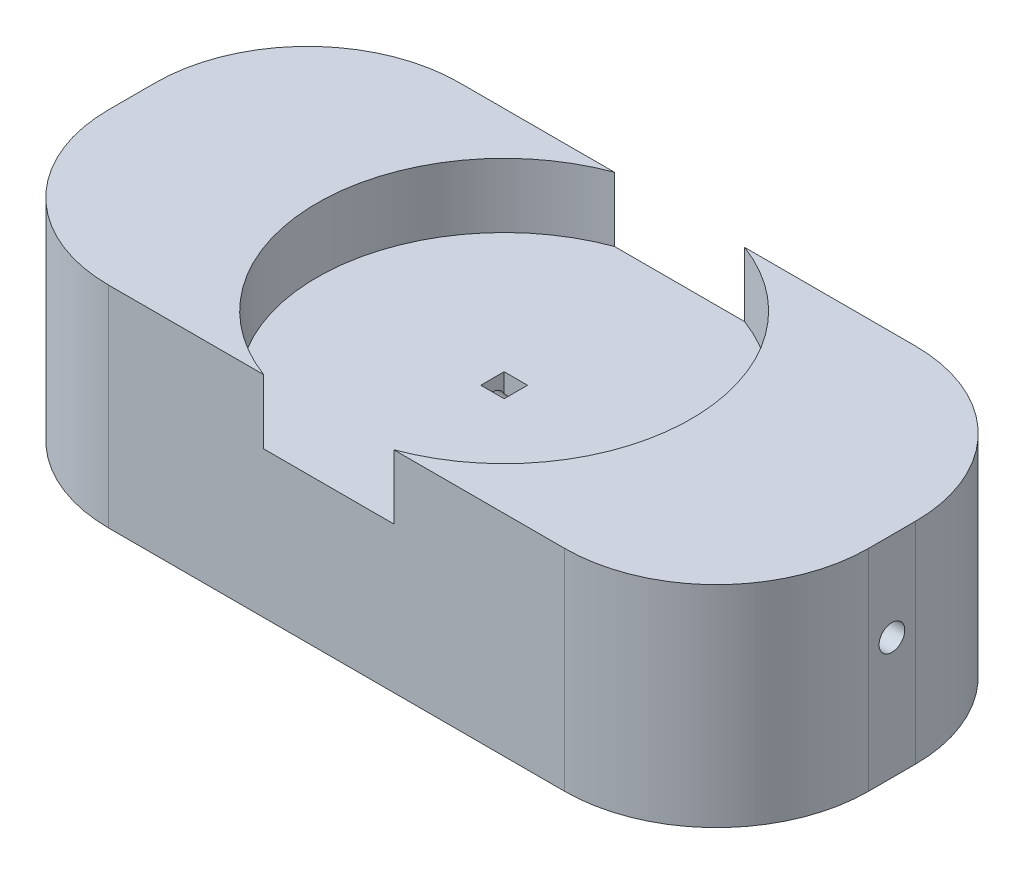
ISO-10303-21;
HEADER;
FILE_DESCRIPTION(('STEP AP214'),'2;1');
FILE_NAME('part.step','',(''),(''),'','','');
FILE_SCHEMA(('AUTOMOTIVE_DESIGN { 1 0 10303 214 1 1 1 1 }'));
ENDSEC;
DATA;
#1=APPLICATION_CONTEXT('core data for automotive mechanical design processes');
#2=APPLICATION_PROTOCOL_DEFINITION('international standard','automotive_design',2000,#1);
#3=PRODUCT_CONTEXT('',#1,'mechanical');
#4=PRODUCT('Part','Part','',(#3));
#5=PRODUCT_RELATED_PRODUCT_CATEGORY('part','',(#4));
#6=PRODUCT_DEFINITION_FORMATION('','',#4);
#7=PRODUCT_DEFINITION_CONTEXT('part definition',#1,'design');
#8=PRODUCT_DEFINITION('design','',#6,#7);
#9=PRODUCT_DEFINITION_SHAPE('','',#8);
#10=(LENGTH_UNIT() NAMED_UNIT(*) SI_UNIT(.MILLI.,.METRE.));
#11=(NAMED_UNIT(*) PLANE_ANGLE_UNIT() SI_UNIT($,.RADIAN.));
#12=(NAMED_UNIT(*) SI_UNIT($,.STERADIAN.) SOLID_ANGLE_UNIT());
#13=UNCERTAINTY_MEASURE_WITH_UNIT(LENGTH_MEASURE(1.E-05),#10,'distance_accuracy_value','');
#14=(GEOMETRIC_REPRESENTATION_CONTEXT(3) GLOBAL_UNCERTAINTY_ASSIGNED_CONTEXT((#13)) GLOBAL_UNIT_ASSIGNED_CONTEXT((#10,
#11,#12)) REPRESENTATION_CONTEXT('',''));
#15=CARTESIAN_POINT('',(0.,0.,0.));
#16=DIRECTION('',(0.,0.,1.));
#17=DIRECTION('',(1.,0.,0.));
#18=AXIS2_PLACEMENT_3D('',#15,#16,#17);
#19=CARTESIAN_POINT('',(0.,58.,0.));
#20=DIRECTION('',(0.,-1.,0.));
#21=DIRECTION('',(0.,0.,-1.));
#22=AXIS2_PLACEMENT_3D('',#19,#20,#21);
#23=PLANE('',#22);
#24=DIRECTION('',(-1.,0.,0.));
#25=VECTOR('',#24,1.);
#26=CARTESIAN_POINT('',(-25.,58.,-15.));
#27=LINE('',#26,#25);
#28=CARTESIAN_POINT('',(27.,58.,-15.));
#29=VERTEX_POINT('',#28);
#30=CARTESIAN_POINT('',(12.3962726493241,58.,-15.));
#31=VERTEX_POINT('',#30);
#32=EDGE_CURVE('E307',#29,#31,#27,.T.);
#33=ORIENTED_EDGE('',*,*,#32,.T.);
#34=CARTESIAN_POINT('',(6.82850828649366,58.,-1.6826817716975E-13));
#35=DIRECTION('',(0.,1.,0.));
#36=DIRECTION('',(0.,0.,1.));
#37=AXIS2_PLACEMENT_3D('',#34,#35,#36);
#38=CIRCLE('',#37,16.);
#39=CARTESIAN_POINT('',(12.3962726493232,58.,15.));
#40=VERTEX_POINT('',#39);
#41=EDGE_CURVE('E248',#40,#31,#38,.T.);
#42=ORIENTED_EDGE('',*,*,#41,.F.);
#43=DIRECTION('',(1.,0.,0.));
#44=VECTOR('',#43,1.);
#45=CARTESIAN_POINT('',(-25.,58.,15.));
#46=LINE('',#45,#44);
#47=CARTESIAN_POINT('',(27.,58.,15.));
#48=VERTEX_POINT('',#47);
#49=EDGE_CURVE('E315',#40,#48,#46,.T.);
#50=ORIENTED_EDGE('',*,*,#49,.T.);
#51=CARTESIAN_POINT('',(27.,58.,2.00000000000001));
#52=DIRECTION('',(0.,-1.,0.));
#53=DIRECTION('',(0.,0.,-1.));
#54=AXIS2_PLACEMENT_3D('',#51,#52,#53);
#55=CIRCLE('',#54,13.);
#56=CARTESIAN_POINT('',(40.,58.,2.00000000000001));
#57=VERTEX_POINT('',#56);
#58=EDGE_CURVE('E338',#48,#57,#55,.F.);
#59=ORIENTED_EDGE('',*,*,#58,.T.);
#60=DIRECTION('',(0.,0.,-1.));
#61=VECTOR('',#60,1.);
#62=CARTESIAN_POINT('',(40.,58.,15.));
#63=LINE('',#62,#61);
#64=CARTESIAN_POINT('',(40.,58.,-2.));
#65=VERTEX_POINT('',#64);
#66=EDGE_CURVE('E302',#57,#65,#63,.T.);
#67=ORIENTED_EDGE('',*,*,#66,.T.);
#68=CARTESIAN_POINT('',(27.,58.,-2.));
#69=DIRECTION('',(0.,-1.,0.));
#70=DIRECTION('',(0.,0.,-1.));
#71=AXIS2_PLACEMENT_3D('',#68,#69,#70);
#72=CIRCLE('',#71,13.);
#73=EDGE_CURVE('E344',#65,#29,#72,.F.);
#74=ORIENTED_EDGE('',*,*,#73,.T.);
#75=EDGE_LOOP('',(#33,#42,#50,#59,#67,#74));
#76=FACE_BOUND('',#75,.T.);
#77=ADVANCED_FACE('F47',(#76),#23,.F.);
#78=CARTESIAN_POINT('',(40.,58.,15.));
#79=DIRECTION('',(-1.,0.,0.));
#80=DIRECTION('',(0.,0.,1.));
#81=AXIS2_PLACEMENT_3D('',#78,#79,#80);
#82=PLANE('',#81);
#83=CARTESIAN_POINT('',(40.,50.4,0.));
#84=DIRECTION('',(-1.,0.,0.));
#85=DIRECTION('',(0.,0.,1.));
#86=AXIS2_PLACEMENT_3D('',#83,#84,#85);
#87=CIRCLE('',#86,1.1);
#88=CARTESIAN_POINT('',(40.,50.4,1.1));
#89=VERTEX_POINT('',#88);
#90=EDGE_CURVE('E244',#89,#89,#87,.T.);
#91=ORIENTED_EDGE('',*,*,#90,.T.);
#92=EDGE_LOOP('',(#91));
#93=FACE_BOUND('',#92,.T.);
#94=DIRECTION('',(0.,0.,1.));
#95=VECTOR('',#94,1.);
#96=CARTESIAN_POINT('',(40.,40.,15.));
#97=LINE('',#96,#95);
#98=CARTESIAN_POINT('',(40.,40.,-2.));
#99=VERTEX_POINT('',#98);
#100=CARTESIAN_POINT('',(40.,40.,2.00000000000001));
#101=VERTEX_POINT('',#100);
#102=EDGE_CURVE('E295',#99,#101,#97,.T.);
#103=ORIENTED_EDGE('',*,*,#102,.F.);
#104=DIRECTION('',(0.,-1.,0.));
#105=VECTOR('',#104,1.);
#106=CARTESIAN_POINT('',(40.,58.,-2.));
#107=LINE('',#106,#105);
#108=EDGE_CURVE('E332',#99,#65,#107,.F.);
#109=ORIENTED_EDGE('',*,*,#108,.T.);
#110=ORIENTED_EDGE('',*,*,#66,.F.);
#111=DIRECTION('',(0.,-1.,0.));
#112=VECTOR('',#111,1.);
#113=CARTESIAN_POINT('',(40.,58.,2.00000000000001));
#114=LINE('',#113,#112);
#115=EDGE_CURVE('E328',#57,#101,#114,.T.);
#116=ORIENTED_EDGE('',*,*,#115,.T.);
#117=EDGE_LOOP('',(#103,#109,#110,#116));
#118=FACE_BOUND('',#117,.T.);
#119=ADVANCED_FACE('F414',(#93,#118),#82,.F.);
#120=CARTESIAN_POINT('',(-25.,58.,-15.));
#121=DIRECTION('',(0.,0.,1.));
#122=DIRECTION('',(1.,0.,0.));
#123=AXIS2_PLACEMENT_3D('',#120,#121,#122);
#124=PLANE('',#123);
#125=DIRECTION('',(-1.,0.,0.));
#126=VECTOR('',#125,1.);
#127=CARTESIAN_POINT('',(-25.,52.5,-15.));
#128=LINE('',#127,#126);
#129=CARTESIAN_POINT('',(12.3962726493241,52.5,-15.));
#130=VERTEX_POINT('',#129);
#131=CARTESIAN_POINT('',(1.26074392366317,52.5,-15.));
#132=VERTEX_POINT('',#131);
#133=EDGE_CURVE('E275',#130,#132,#128,.T.);
#134=ORIENTED_EDGE('',*,*,#133,.F.);
#135=DIRECTION('',(0.,1.,0.));
#136=VECTOR('',#135,1.);
#137=CARTESIAN_POINT('',(12.3962726493241,52.5,-15.));
#138=LINE('',#137,#136);
#139=EDGE_CURVE('E271',#130,#31,#138,.T.);
#140=ORIENTED_EDGE('',*,*,#139,.T.);
#141=ORIENTED_EDGE('',*,*,#32,.F.);
#142=DIRECTION('',(0.,-1.,0.));
#143=VECTOR('',#142,1.);
#144=CARTESIAN_POINT('',(27.,58.,-15.));
#145=LINE('',#144,#143);
#146=CARTESIAN_POINT('',(27.,40.,-15.));
#147=VERTEX_POINT('',#146);
#148=EDGE_CURVE('E324',#29,#147,#145,.T.);
#149=ORIENTED_EDGE('',*,*,#148,.T.);
#150=DIRECTION('',(1.,0.,0.));
#151=VECTOR('',#150,1.);
#152=CARTESIAN_POINT('',(-25.,40.,-15.));
#153=LINE('',#152,#151);
#154=CARTESIAN_POINT('',(-12.,40.,-15.));
#155=VERTEX_POINT('',#154);
#156=EDGE_CURVE('E292',#155,#147,#153,.T.);
#157=ORIENTED_EDGE('',*,*,#156,.F.);
#158=DIRECTION('',(0.,-1.,0.));
#159=VECTOR('',#158,1.);
#160=CARTESIAN_POINT('',(-12.,58.,-15.));
#161=LINE('',#160,#159);
#162=CARTESIAN_POINT('',(-12.,58.,-15.));
#163=VERTEX_POINT('',#162);
#164=EDGE_CURVE('E320',#155,#163,#161,.F.);
#165=ORIENTED_EDGE('',*,*,#164,.T.);
#166=CARTESIAN_POINT('',(1.26074392366317,58.,-15.));
#167=VERTEX_POINT('',#166);
#168=EDGE_CURVE('E306',#167,#163,#27,.T.);
#169=ORIENTED_EDGE('',*,*,#168,.F.);
#170=DIRECTION('',(0.,1.,0.));
#171=VECTOR('',#170,1.);
#172=CARTESIAN_POINT('',(1.26074392366316,52.5,-15.));
#173=LINE('',#172,#171);
#174=EDGE_CURVE('E267',#167,#132,#173,.F.);
#175=ORIENTED_EDGE('',*,*,#174,.T.);
#176=EDGE_LOOP('',(#134,#140,#141,#149,#157,#165,#169,#175));
#177=FACE_BOUND('',#176,.T.);
#178=ADVANCED_FACE('F423',(#177),#124,.F.);
#179=CARTESIAN_POINT('',(-25.,58.,15.));
#180=DIRECTION('',(1.,0.,0.));
#181=DIRECTION('',(0.,0.,-1.));
#182=AXIS2_PLACEMENT_3D('',#179,#180,#181);
#183=PLANE('',#182);
#184=CARTESIAN_POINT('',(-25.,50.4,0.));
#185=DIRECTION('',(-1.,0.,0.));
#186=DIRECTION('',(0.,0.,1.));
#187=AXIS2_PLACEMENT_3D('',#184,#185,#186);
#188=CIRCLE('',#187,1.1);
#189=CARTESIAN_POINT('',(-25.,50.4,1.1));
#190=VERTEX_POINT('',#189);
#191=EDGE_CURVE('E235',#190,#190,#188,.T.);
#192=ORIENTED_EDGE('',*,*,#191,.F.);
#193=EDGE_LOOP('',(#192));
#194=FACE_BOUND('',#193,.T.);
#195=DIRECTION('',(0.,0.,-1.));
#196=VECTOR('',#195,1.);
#197=CARTESIAN_POINT('',(-25.,40.,15.));
#198=LINE('',#197,#196);
#199=CARTESIAN_POINT('',(-25.,40.,2.00000000000001));
#200=VERTEX_POINT('',#199);
#201=CARTESIAN_POINT('',(-25.,40.,-1.99999999999999));
#202=VERTEX_POINT('',#201);
#203=EDGE_CURVE('E281',#200,#202,#198,.T.);
#204=ORIENTED_EDGE('',*,*,#203,.F.);
#205=DIRECTION('',(0.,-1.,0.));
#206=VECTOR('',#205,1.);
#207=CARTESIAN_POINT('',(-25.,58.,2.00000000000001));
#208=LINE('',#207,#206);
#209=CARTESIAN_POINT('',(-25.,58.,2.00000000000001));
#210=VERTEX_POINT('',#209);
#211=EDGE_CURVE('E347',#200,#210,#208,.F.);
#212=ORIENTED_EDGE('',*,*,#211,.T.);
#213=DIRECTION('',(0.,0.,1.));
#214=VECTOR('',#213,1.);
#215=CARTESIAN_POINT('',(-25.,58.,15.));
#216=LINE('',#215,#214);
#217=CARTESIAN_POINT('',(-25.,58.,-1.99999999999999));
#218=VERTEX_POINT('',#217);
#219=EDGE_CURVE('E311',#218,#210,#216,.T.);
#220=ORIENTED_EDGE('',*,*,#219,.F.);
#221=DIRECTION('',(0.,-1.,0.));
#222=VECTOR('',#221,1.);
#223=CARTESIAN_POINT('',(-25.,58.,-1.99999999999999));
#224=LINE('',#223,#222);
#225=EDGE_CURVE('E350',#218,#202,#224,.T.);
#226=ORIENTED_EDGE('',*,*,#225,.T.);
#227=EDGE_LOOP('',(#204,#212,#220,#226));
#228=FACE_BOUND('',#227,.T.);
#229=ADVANCED_FACE('F451',(#194,#228),#183,.F.);
#230=CARTESIAN_POINT('',(-25.,58.,15.));
#231=DIRECTION('',(0.,0.,-1.));
#232=DIRECTION('',(-1.,0.,0.));
#233=AXIS2_PLACEMENT_3D('',#230,#231,#232);
#234=PLANE('',#233);
#235=DIRECTION('',(1.,0.,0.));
#236=VECTOR('',#235,1.);
#237=CARTESIAN_POINT('',(-25.,52.5,15.));
#238=LINE('',#237,#236);
#239=CARTESIAN_POINT('',(1.2607439236641,52.5,15.));
#240=VERTEX_POINT('',#239);
#241=CARTESIAN_POINT('',(12.3962726493232,52.5,15.));
#242=VERTEX_POINT('',#241);
#243=EDGE_CURVE('E370',#240,#242,#238,.T.);
#244=ORIENTED_EDGE('',*,*,#243,.F.);
#245=DIRECTION('',(0.,1.,0.));
#246=VECTOR('',#245,1.);
#247=CARTESIAN_POINT('',(1.26074392366409,52.5,15.));
#248=LINE('',#247,#246);
#249=CARTESIAN_POINT('',(1.2607439236641,58.,15.));
#250=VERTEX_POINT('',#249);
#251=EDGE_CURVE('E263',#240,#250,#248,.T.);
#252=ORIENTED_EDGE('',*,*,#251,.T.);
#253=CARTESIAN_POINT('',(-12.,58.,15.));
#254=VERTEX_POINT('',#253);
#255=EDGE_CURVE('E316',#254,#250,#46,.T.);
#256=ORIENTED_EDGE('',*,*,#255,.F.);
#257=DIRECTION('',(0.,-1.,0.));
#258=VECTOR('',#257,1.);
#259=CARTESIAN_POINT('',(-12.,58.,15.));
#260=LINE('',#259,#258);
#261=CARTESIAN_POINT('',(-12.,40.,15.));
#262=VERTEX_POINT('',#261);
#263=EDGE_CURVE('E354',#254,#262,#260,.T.);
#264=ORIENTED_EDGE('',*,*,#263,.T.);
#265=DIRECTION('',(-1.,0.,0.));
#266=VECTOR('',#265,1.);
#267=CARTESIAN_POINT('',(-25.,40.,15.));
#268=LINE('',#267,#266);
#269=CARTESIAN_POINT('',(27.,40.,15.));
#270=VERTEX_POINT('',#269);
#271=EDGE_CURVE('E278',#270,#262,#268,.T.);
#272=ORIENTED_EDGE('',*,*,#271,.F.);
#273=DIRECTION('',(0.,-1.,0.));
#274=VECTOR('',#273,1.);
#275=CARTESIAN_POINT('',(27.,58.,15.));
#276=LINE('',#275,#274);
#277=EDGE_CURVE('E358',#270,#48,#276,.F.);
#278=ORIENTED_EDGE('',*,*,#277,.T.);
#279=ORIENTED_EDGE('',*,*,#49,.F.);
#280=DIRECTION('',(0.,1.,0.));
#281=VECTOR('',#280,1.);
#282=CARTESIAN_POINT('',(12.3962726493232,52.5,15.));
#283=LINE('',#282,#281);
#284=EDGE_CURVE('E256',#40,#242,#283,.F.);
#285=ORIENTED_EDGE('',*,*,#284,.T.);
#286=EDGE_LOOP('',(#244,#252,#256,#264,#272,#278,#279,#285));
#287=FACE_BOUND('',#286,.T.);
#288=ADVANCED_FACE('F446',(#287),#234,.F.);
#289=CARTESIAN_POINT('',(27.,58.,-2.));
#290=DIRECTION('',(0.,-1.,0.));
#291=DIRECTION('',(0.,0.,-1.));
#292=AXIS2_PLACEMENT_3D('',#289,#290,#291);
#293=CYLINDRICAL_SURFACE('',#292,13.);
#294=ORIENTED_EDGE('',*,*,#108,.F.);
#295=CARTESIAN_POINT('',(27.,40.,-2.));
#296=DIRECTION('',(0.,-1.,0.));
#297=DIRECTION('',(0.,0.,-1.));
#298=AXIS2_PLACEMENT_3D('',#295,#296,#297);
#299=CIRCLE('',#298,13.);
#300=EDGE_CURVE('E298',#99,#147,#299,.F.);
#301=ORIENTED_EDGE('',*,*,#300,.T.);
#302=ORIENTED_EDGE('',*,*,#148,.F.);
#303=ORIENTED_EDGE('',*,*,#73,.F.);
#304=EDGE_LOOP('',(#294,#301,#302,#303));
#305=FACE_BOUND('',#304,.T.);
#306=ADVANCED_FACE('F466',(#305),#293,.T.);
#307=CARTESIAN_POINT('',(-12.,58.,-1.99999999999999));
#308=DIRECTION('',(0.,-1.,0.));
#309=DIRECTION('',(0.,0.,-1.));
#310=AXIS2_PLACEMENT_3D('',#307,#308,#309);
#311=CYLINDRICAL_SURFACE('',#310,13.);
#312=ORIENTED_EDGE('',*,*,#164,.F.);
#313=CARTESIAN_POINT('',(-12.,40.,-1.99999999999999));
#314=DIRECTION('',(0.,-1.,0.));
#315=DIRECTION('',(0.,0.,-1.));
#316=AXIS2_PLACEMENT_3D('',#313,#314,#315);
#317=CIRCLE('',#316,13.);
#318=EDGE_CURVE('E288',#155,#202,#317,.F.);
#319=ORIENTED_EDGE('',*,*,#318,.T.);
#320=ORIENTED_EDGE('',*,*,#225,.F.);
#321=CARTESIAN_POINT('',(-12.,58.,-1.99999999999999));
#322=DIRECTION('',(0.,-1.,0.));
#323=DIRECTION('',(0.,0.,-1.));
#324=AXIS2_PLACEMENT_3D('',#321,#322,#323);
#325=CIRCLE('',#324,13.);
#326=EDGE_CURVE('E341',#163,#218,#325,.F.);
#327=ORIENTED_EDGE('',*,*,#326,.F.);
#328=EDGE_LOOP('',(#312,#319,#320,#327));
#329=FACE_BOUND('',#328,.T.);
#330=ADVANCED_FACE('F457',(#329),#311,.T.);
#331=CARTESIAN_POINT('',(27.,58.,2.00000000000001));
#332=DIRECTION('',(0.,-1.,0.));
#333=DIRECTION('',(0.,0.,-1.));
#334=AXIS2_PLACEMENT_3D('',#331,#332,#333);
#335=CYLINDRICAL_SURFACE('',#334,13.);
#336=ORIENTED_EDGE('',*,*,#277,.F.);
#337=CARTESIAN_POINT('',(27.,40.,2.00000000000001));
#338=DIRECTION('',(0.,-1.,0.));
#339=DIRECTION('',(0.,0.,-1.));
#340=AXIS2_PLACEMENT_3D('',#337,#338,#339);
#341=CIRCLE('',#340,13.);
#342=EDGE_CURVE('E284',#270,#101,#341,.F.);
#343=ORIENTED_EDGE('',*,*,#342,.T.);
#344=ORIENTED_EDGE('',*,*,#115,.F.);
#345=ORIENTED_EDGE('',*,*,#58,.F.);
#346=EDGE_LOOP('',(#336,#343,#344,#345));
#347=FACE_BOUND('',#346,.T.);
#348=ADVANCED_FACE('F438',(#347),#335,.T.);
#349=CARTESIAN_POINT('',(-12.,58.,2.00000000000001));
#350=DIRECTION('',(0.,-1.,0.));
#351=DIRECTION('',(0.,0.,-1.));
#352=AXIS2_PLACEMENT_3D('',#349,#350,#351);
#353=CYLINDRICAL_SURFACE('',#352,13.);
#354=ORIENTED_EDGE('',*,*,#211,.F.);
#355=CARTESIAN_POINT('',(-12.,40.,2.00000000000001));
#356=DIRECTION('',(0.,-1.,0.));
#357=DIRECTION('',(0.,0.,-1.));
#358=AXIS2_PLACEMENT_3D('',#355,#356,#357);
#359=CIRCLE('',#358,13.);
#360=EDGE_CURVE('E362',#200,#262,#359,.F.);
#361=ORIENTED_EDGE('',*,*,#360,.T.);
#362=ORIENTED_EDGE('',*,*,#263,.F.);
#363=CARTESIAN_POINT('',(-12.,58.,2.00000000000001));
#364=DIRECTION('',(0.,-1.,0.));
#365=DIRECTION('',(0.,0.,-1.));
#366=AXIS2_PLACEMENT_3D('',#363,#364,#365);
#367=CIRCLE('',#366,13.);
#368=EDGE_CURVE('E335',#210,#254,#367,.F.);
#369=ORIENTED_EDGE('',*,*,#368,.F.);
#370=EDGE_LOOP('',(#354,#361,#362,#369));
#371=FACE_BOUND('',#370,.T.);
#372=ADVANCED_FACE('F49',(#371),#353,.T.);
#373=ORIENTED_EDGE('',*,*,#255,.T.);
#374=CARTESIAN_POINT('',(6.82850828649366,58.,-1.6826817716975E-13));
#375=DIRECTION('',(0.,-1.,0.));
#376=DIRECTION('',(0.,0.,-1.));
#377=AXIS2_PLACEMENT_3D('',#374,#375,#376);
#378=CIRCLE('',#377,16.);
#379=EDGE_CURVE('E366',#250,#167,#378,.T.);
#380=ORIENTED_EDGE('',*,*,#379,.T.);
#381=ORIENTED_EDGE('',*,*,#168,.T.);
#382=ORIENTED_EDGE('',*,*,#326,.T.);
#383=ORIENTED_EDGE('',*,*,#219,.T.);
#384=ORIENTED_EDGE('',*,*,#368,.T.);
#385=EDGE_LOOP('',(#373,#380,#381,#382,#383,#384));
#386=FACE_BOUND('',#385,.T.);
#387=ADVANCED_FACE('F417',(#386),#23,.F.);
#388=CARTESIAN_POINT('',(0.,40.,0.));
#389=DIRECTION('',(0.,-1.,0.));
#390=DIRECTION('',(0.,0.,-1.));
#391=AXIS2_PLACEMENT_3D('',#388,#389,#390);
#392=PLANE('',#391);
#393=ORIENTED_EDGE('',*,*,#102,.T.);
#394=ORIENTED_EDGE('',*,*,#342,.F.);
#395=ORIENTED_EDGE('',*,*,#271,.T.);
#396=ORIENTED_EDGE('',*,*,#360,.F.);
#397=ORIENTED_EDGE('',*,*,#203,.T.);
#398=ORIENTED_EDGE('',*,*,#318,.F.);
#399=ORIENTED_EDGE('',*,*,#156,.T.);
#400=ORIENTED_EDGE('',*,*,#300,.F.);
#401=EDGE_LOOP('',(#393,#394,#395,#396,#397,#398,#399,#400));
#402=FACE_BOUND('',#401,.T.);
#403=ADVANCED_FACE('F429',(#402),#392,.T.);
#404=CARTESIAN_POINT('',(6.82850828649366,52.5,-1.6826817716975E-13));
#405=DIRECTION('',(0.,1.,0.));
#406=DIRECTION('',(0.,0.,1.));
#407=AXIS2_PLACEMENT_3D('',#404,#405,#406);
#408=PLANE('',#407);
#409=DIRECTION('',(0.,0.,-1.));
#410=VECTOR('',#409,1.);
#411=CARTESIAN_POINT('',(7.82850828649366,52.5,0.999999999999832));
#412=LINE('',#411,#410);
#413=CARTESIAN_POINT('',(7.82850828649366,52.5,0.999999999999832));
#414=VERTEX_POINT('',#413);
#415=CARTESIAN_POINT('',(7.82850828649366,52.5,-1.00000000000017));
#416=VERTEX_POINT('',#415);
#417=EDGE_CURVE('E65',#414,#416,#412,.T.);
#418=ORIENTED_EDGE('',*,*,#417,.F.);
#419=DIRECTION('',(1.,0.,0.));
#420=VECTOR('',#419,1.);
#421=CARTESIAN_POINT('',(5.82850828649366,52.5,0.999999999999832));
#422=LINE('',#421,#420);
#423=CARTESIAN_POINT('',(5.82850828649366,52.5,0.999999999999832));
#424=VERTEX_POINT('',#423);
#425=EDGE_CURVE('E212',#424,#414,#422,.T.);
#426=ORIENTED_EDGE('',*,*,#425,.F.);
#427=DIRECTION('',(0.,0.,1.));
#428=VECTOR('',#427,1.);
#429=CARTESIAN_POINT('',(5.82850828649366,52.5,0.999999999999832));
#430=LINE('',#429,#428);
#431=CARTESIAN_POINT('',(5.82850828649366,52.5,-1.00000000000017));
#432=VERTEX_POINT('',#431);
#433=EDGE_CURVE('E216',#432,#424,#430,.T.);
#434=ORIENTED_EDGE('',*,*,#433,.F.);
#435=DIRECTION('',(-1.,0.,0.));
#436=VECTOR('',#435,1.);
#437=CARTESIAN_POINT('',(5.82850828649366,52.5,-1.00000000000017));
#438=LINE('',#437,#436);
#439=EDGE_CURVE('E225',#416,#432,#438,.T.);
#440=ORIENTED_EDGE('',*,*,#439,.F.);
#441=EDGE_LOOP('',(#418,#426,#434,#440));
#442=FACE_BOUND('',#441,.T.);
#443=ORIENTED_EDGE('',*,*,#133,.T.);
#444=CARTESIAN_POINT('',(6.82850828649366,52.5,-1.6826817716975E-13));
#445=DIRECTION('',(0.,1.,0.));
#446=DIRECTION('',(0.,0.,1.));
#447=AXIS2_PLACEMENT_3D('',#444,#445,#446);
#448=CIRCLE('',#447,16.);
#449=EDGE_CURVE('E257',#132,#240,#448,.T.);
#450=ORIENTED_EDGE('',*,*,#449,.T.);
#451=ORIENTED_EDGE('',*,*,#243,.T.);
#452=EDGE_CURVE('E252',#242,#130,#448,.T.);
#453=ORIENTED_EDGE('',*,*,#452,.T.);
#454=EDGE_LOOP('',(#443,#450,#451,#453));
#455=FACE_BOUND('',#454,.T.);
#456=ADVANCED_FACE('F435',(#442,#455),#408,.T.);
#457=CARTESIAN_POINT('',(6.82850828649366,52.5,-1.6826817716975E-13));
#458=DIRECTION('',(0.,1.,0.));
#459=DIRECTION('',(0.,0.,1.));
#460=AXIS2_PLACEMENT_3D('',#457,#458,#459);
#461=CYLINDRICAL_SURFACE('',#460,16.);
#462=ORIENTED_EDGE('',*,*,#452,.F.);
#463=ORIENTED_EDGE('',*,*,#284,.F.);
#464=ORIENTED_EDGE('',*,*,#41,.T.);
#465=ORIENTED_EDGE('',*,*,#139,.F.);
#466=EDGE_LOOP('',(#462,#463,#464,#465));
#467=FACE_BOUND('',#466,.T.);
#468=ADVANCED_FACE('F570',(#467),#461,.F.);
#469=ORIENTED_EDGE('',*,*,#379,.F.);
#470=ORIENTED_EDGE('',*,*,#251,.F.);
#471=ORIENTED_EDGE('',*,*,#449,.F.);
#472=ORIENTED_EDGE('',*,*,#174,.F.);
#473=EDGE_LOOP('',(#469,#470,#471,#472));
#474=FACE_BOUND('',#473,.T.);
#475=ADVANCED_FACE('F560',(#474),#461,.F.);
#476=CARTESIAN_POINT('',(40.,50.4,0.));
#477=DIRECTION('',(-1.,0.,0.));
#478=DIRECTION('',(0.,0.,1.));
#479=AXIS2_PLACEMENT_3D('',#476,#477,#478);
#480=CYLINDRICAL_SURFACE('',#479,1.1);
#481=DIRECTION('',(-1.,0.,0.));
#482=VECTOR('',#481,1.);
#483=CARTESIAN_POINT('',(40.,49.9417424305048,-1.00000000000017));
#484=LINE('',#483,#482);
#485=CARTESIAN_POINT('',(5.82850828649366,49.9417424305048,-1.00000000000017));
#486=VERTEX_POINT('',#485);
#487=CARTESIAN_POINT('',(7.82850828649365,49.9417424305048,-1.00000000000017));
#488=VERTEX_POINT('',#487);
#489=EDGE_CURVE('E387',#486,#488,#484,.F.);
#490=ORIENTED_EDGE('',*,*,#489,.T.);
#491=CARTESIAN_POINT('',(7.82850828649365,50.4,0.));
#492=DIRECTION('',(1.,0.,0.));
#493=DIRECTION('',(0.,0.,-1.));
#494=AXIS2_PLACEMENT_3D('',#491,#492,#493);
#495=CIRCLE('',#494,1.1);
#496=CARTESIAN_POINT('',(7.82850828649366,49.941742430504,0.999999999999832));
#497=VERTEX_POINT('',#496);
#498=EDGE_CURVE('E11',#488,#497,#495,.F.);
#499=ORIENTED_EDGE('',*,*,#498,.T.);
#500=DIRECTION('',(-1.,0.,0.));
#501=VECTOR('',#500,1.);
#502=CARTESIAN_POINT('',(40.,49.941742430504,0.999999999999832));
#503=LINE('',#502,#501);
#504=CARTESIAN_POINT('',(5.82850828649366,49.941742430504,0.999999999999832));
#505=VERTEX_POINT('',#504);
#506=EDGE_CURVE('E51',#497,#505,#503,.T.);
#507=ORIENTED_EDGE('',*,*,#506,.T.);
#508=CARTESIAN_POINT('',(5.82850828649366,50.4,0.));
#509=DIRECTION('',(-1.,0.,0.));
#510=DIRECTION('',(0.,0.,1.));
#511=AXIS2_PLACEMENT_3D('',#508,#509,#510);
#512=CIRCLE('',#511,1.1);
#513=EDGE_CURVE('E382',#505,#486,#512,.F.);
#514=ORIENTED_EDGE('',*,*,#513,.T.);
#515=EDGE_LOOP('',(#490,#499,#507,#514));
#516=FACE_BOUND('',#515,.T.);
#517=DIRECTION('',(-1.,0.,0.));
#518=VECTOR('',#517,1.);
#519=CARTESIAN_POINT('',(40.,50.8582575694959,0.999999999999832));
#520=LINE('',#519,#518);
#521=CARTESIAN_POINT('',(5.82850828649366,50.8582575694959,0.999999999999832));
#522=VERTEX_POINT('',#521);
#523=CARTESIAN_POINT('',(7.82850828649366,50.8582575694959,0.999999999999832));
#524=VERTEX_POINT('',#523);
#525=EDGE_CURVE('E381',#522,#524,#520,.F.);
#526=ORIENTED_EDGE('',*,*,#525,.T.);
#527=CARTESIAN_POINT('',(7.82850828649366,50.8582575694952,-1.00000000000017));
#528=VERTEX_POINT('',#527);
#529=EDGE_CURVE('E58',#524,#528,#495,.F.);
#530=ORIENTED_EDGE('',*,*,#529,.T.);
#531=DIRECTION('',(-1.,0.,0.));
#532=VECTOR('',#531,1.);
#533=CARTESIAN_POINT('',(40.,50.8582575694952,-1.00000000000017));
#534=LINE('',#533,#532);
#535=CARTESIAN_POINT('',(5.82850828649366,50.8582575694952,-1.00000000000017));
#536=VERTEX_POINT('',#535);
#537=EDGE_CURVE('E373',#528,#536,#534,.T.);
#538=ORIENTED_EDGE('',*,*,#537,.T.);
#539=EDGE_CURVE('E377',#536,#522,#512,.F.);
#540=ORIENTED_EDGE('',*,*,#539,.T.);
#541=EDGE_LOOP('',(#526,#530,#538,#540));
#542=FACE_BOUND('',#541,.T.);
#543=ORIENTED_EDGE('',*,*,#90,.F.);
#544=EDGE_LOOP('',(#543));
#545=FACE_BOUND('',#544,.T.);
#546=ORIENTED_EDGE('',*,*,#191,.T.);
#547=EDGE_LOOP('',(#546));
#548=FACE_BOUND('',#547,.T.);
#549=ADVANCED_FACE('F394',(#516,#542,#545,#548),#480,.F.);
#550=CARTESIAN_POINT('',(5.82850828649366,44.5,-1.00000000000017));
#551=DIRECTION('',(0.,0.,-1.));
#552=DIRECTION('',(-1.,0.,0.));
#553=AXIS2_PLACEMENT_3D('',#550,#551,#552);
#554=PLANE('',#553);
#555=DIRECTION('',(0.,1.,0.));
#556=VECTOR('',#555,1.);
#557=CARTESIAN_POINT('',(7.82850828649366,44.5,-1.00000000000017));
#558=LINE('',#557,#556);
#559=EDGE_CURVE('E195',#528,#416,#558,.T.);
#560=ORIENTED_EDGE('',*,*,#559,.T.);
#561=ORIENTED_EDGE('',*,*,#439,.T.);
#562=DIRECTION('',(0.,1.,0.));
#563=VECTOR('',#562,1.);
#564=CARTESIAN_POINT('',(5.82850828649366,44.5,-1.00000000000017));
#565=LINE('',#564,#563);
#566=EDGE_CURVE('E194',#536,#432,#565,.T.);
#567=ORIENTED_EDGE('',*,*,#566,.F.);
#568=ORIENTED_EDGE('',*,*,#537,.F.);
#569=EDGE_LOOP('',(#560,#561,#567,#568));
#570=FACE_BOUND('',#569,.T.);
#571=ADVANCED_FACE('F408',(#570),#554,.F.);
#572=CARTESIAN_POINT('',(5.82850828649366,44.5,0.999999999999832));
#573=DIRECTION('',(-1.,0.,0.));
#574=DIRECTION('',(0.,0.,1.));
#575=AXIS2_PLACEMENT_3D('',#572,#573,#574);
#576=PLANE('',#575);
#577=ORIENTED_EDGE('',*,*,#566,.T.);
#578=ORIENTED_EDGE('',*,*,#433,.T.);
#579=DIRECTION('',(0.,1.,0.));
#580=VECTOR('',#579,1.);
#581=CARTESIAN_POINT('',(5.82850828649366,44.5,0.999999999999832));
#582=LINE('',#581,#580);
#583=EDGE_CURVE('E241',#522,#424,#582,.T.);
#584=ORIENTED_EDGE('',*,*,#583,.F.);
#585=ORIENTED_EDGE('',*,*,#539,.F.);
#586=EDGE_LOOP('',(#577,#578,#584,#585));
#587=FACE_BOUND('',#586,.T.);
#588=ADVANCED_FACE('F402',(#587),#576,.F.);
#589=CARTESIAN_POINT('',(5.82850828649366,44.5,0.999999999999832));
#590=DIRECTION('',(0.,0.,1.));
#591=DIRECTION('',(1.,0.,0.));
#592=AXIS2_PLACEMENT_3D('',#589,#590,#591);
#593=PLANE('',#592);
#594=ORIENTED_EDGE('',*,*,#583,.T.);
#595=ORIENTED_EDGE('',*,*,#425,.T.);
#596=DIRECTION('',(0.,1.,0.));
#597=VECTOR('',#596,1.);
#598=CARTESIAN_POINT('',(7.82850828649366,44.5,0.999999999999832));
#599=LINE('',#598,#597);
#600=EDGE_CURVE('E236',#524,#414,#599,.T.);
#601=ORIENTED_EDGE('',*,*,#600,.F.);
#602=ORIENTED_EDGE('',*,*,#525,.F.);
#603=EDGE_LOOP('',(#594,#595,#601,#602));
#604=FACE_BOUND('',#603,.T.);
#605=ADVANCED_FACE('F410',(#604),#593,.F.);
#606=CARTESIAN_POINT('',(7.82850828649366,44.5,0.999999999999832));
#607=DIRECTION('',(1.,0.,0.));
#608=DIRECTION('',(0.,0.,-1.));
#609=AXIS2_PLACEMENT_3D('',#606,#607,#608);
#610=PLANE('',#609);
#611=ORIENTED_EDGE('',*,*,#600,.T.);
#612=ORIENTED_EDGE('',*,*,#417,.T.);
#613=ORIENTED_EDGE('',*,*,#559,.F.);
#614=ORIENTED_EDGE('',*,*,#529,.F.);
#615=EDGE_LOOP('',(#611,#612,#613,#614));
#616=FACE_BOUND('',#615,.T.);
#617=ADVANCED_FACE('F494',(#616),#610,.F.);
#618=CARTESIAN_POINT('',(7.82850828649366,44.5,-1.00000000000017));
#619=VERTEX_POINT('',#618);
#620=EDGE_CURVE('E73',#619,#488,#558,.T.);
#621=ORIENTED_EDGE('',*,*,#620,.F.);
#622=DIRECTION('',(0.,0.,-1.));
#623=VECTOR('',#622,1.);
#624=CARTESIAN_POINT('',(7.82850828649366,44.5,0.999999999999832));
#625=LINE('',#624,#623);
#626=CARTESIAN_POINT('',(7.82850828649366,44.5,0.999999999999832));
#627=VERTEX_POINT('',#626);
#628=EDGE_CURVE('E190',#627,#619,#625,.T.);
#629=ORIENTED_EDGE('',*,*,#628,.F.);
#630=EDGE_CURVE('E232',#627,#497,#599,.T.);
#631=ORIENTED_EDGE('',*,*,#630,.T.);
#632=ORIENTED_EDGE('',*,*,#498,.F.);
#633=EDGE_LOOP('',(#621,#629,#631,#632));
#634=FACE_BOUND('',#633,.T.);
#635=ADVANCED_FACE('F187',(#634),#610,.F.);
#636=ORIENTED_EDGE('',*,*,#630,.F.);
#637=DIRECTION('',(1.,0.,0.));
#638=VECTOR('',#637,1.);
#639=CARTESIAN_POINT('',(5.82850828649366,44.5,0.999999999999832));
#640=LINE('',#639,#638);
#641=CARTESIAN_POINT('',(5.82850828649366,44.5,0.999999999999832));
#642=VERTEX_POINT('',#641);
#643=EDGE_CURVE('E210',#642,#627,#640,.T.);
#644=ORIENTED_EDGE('',*,*,#643,.F.);
#645=EDGE_CURVE('E237',#642,#505,#582,.T.);
#646=ORIENTED_EDGE('',*,*,#645,.T.);
#647=ORIENTED_EDGE('',*,*,#506,.F.);
#648=EDGE_LOOP('',(#636,#644,#646,#647));
#649=FACE_BOUND('',#648,.T.);
#650=ADVANCED_FACE('F397',(#649),#593,.F.);
#651=ORIENTED_EDGE('',*,*,#645,.F.);
#652=DIRECTION('',(0.,0.,1.));
#653=VECTOR('',#652,1.);
#654=CARTESIAN_POINT('',(5.82850828649366,44.5,0.999999999999832));
#655=LINE('',#654,#653);
#656=CARTESIAN_POINT('',(5.82850828649366,44.5,-1.00000000000017));
#657=VERTEX_POINT('',#656);
#658=EDGE_CURVE('E206',#657,#642,#655,.T.);
#659=ORIENTED_EDGE('',*,*,#658,.F.);
#660=EDGE_CURVE('E201',#657,#486,#565,.T.);
#661=ORIENTED_EDGE('',*,*,#660,.T.);
#662=ORIENTED_EDGE('',*,*,#513,.F.);
#663=EDGE_LOOP('',(#651,#659,#661,#662));
#664=FACE_BOUND('',#663,.T.);
#665=ADVANCED_FACE('F399',(#664),#576,.F.);
#666=ORIENTED_EDGE('',*,*,#660,.F.);
#667=DIRECTION('',(-1.,0.,0.));
#668=VECTOR('',#667,1.);
#669=CARTESIAN_POINT('',(5.82850828649366,44.5,-1.00000000000017));
#670=LINE('',#669,#668);
#671=EDGE_CURVE('E198',#619,#657,#670,.T.);
#672=ORIENTED_EDGE('',*,*,#671,.F.);
#673=ORIENTED_EDGE('',*,*,#620,.T.);
#674=ORIENTED_EDGE('',*,*,#489,.F.);
#675=EDGE_LOOP('',(#666,#672,#673,#674));
#676=FACE_BOUND('',#675,.T.);
#677=ADVANCED_FACE('F199',(#676),#554,.F.);
#678=CARTESIAN_POINT('',(0.,44.5,0.));
#679=DIRECTION('',(0.,-1.,0.));
#680=DIRECTION('',(0.,0.,-1.));
#681=AXIS2_PLACEMENT_3D('',#678,#679,#680);
#682=PLANE('',#681);
#683=ORIENTED_EDGE('',*,*,#628,.T.);
#684=ORIENTED_EDGE('',*,*,#671,.T.);
#685=ORIENTED_EDGE('',*,*,#658,.T.);
#686=ORIENTED_EDGE('',*,*,#643,.T.);
#687=EDGE_LOOP('',(#683,#684,#685,#686));
#688=FACE_BOUND('',#687,.T.);
#689=ADVANCED_FACE('F208',(#688),#682,.F.);
#690=CLOSED_SHELL('',(#77,#119,#178,#229,#288,#306,#330,#348,#372,#387,#403,#456,#468,#475,#549,
#571,#588,#605,#617,#635,#650,#665,#677,#689));
#691=MANIFOLD_SOLID_BREP('B2',#690);
#692=ADVANCED_BREP_SHAPE_REPRESENTATION('',(#18,#691),#14);
#693=SHAPE_DEFINITION_REPRESENTATION(#9,#692);
ENDSEC;
END-ISO-10303-21;
